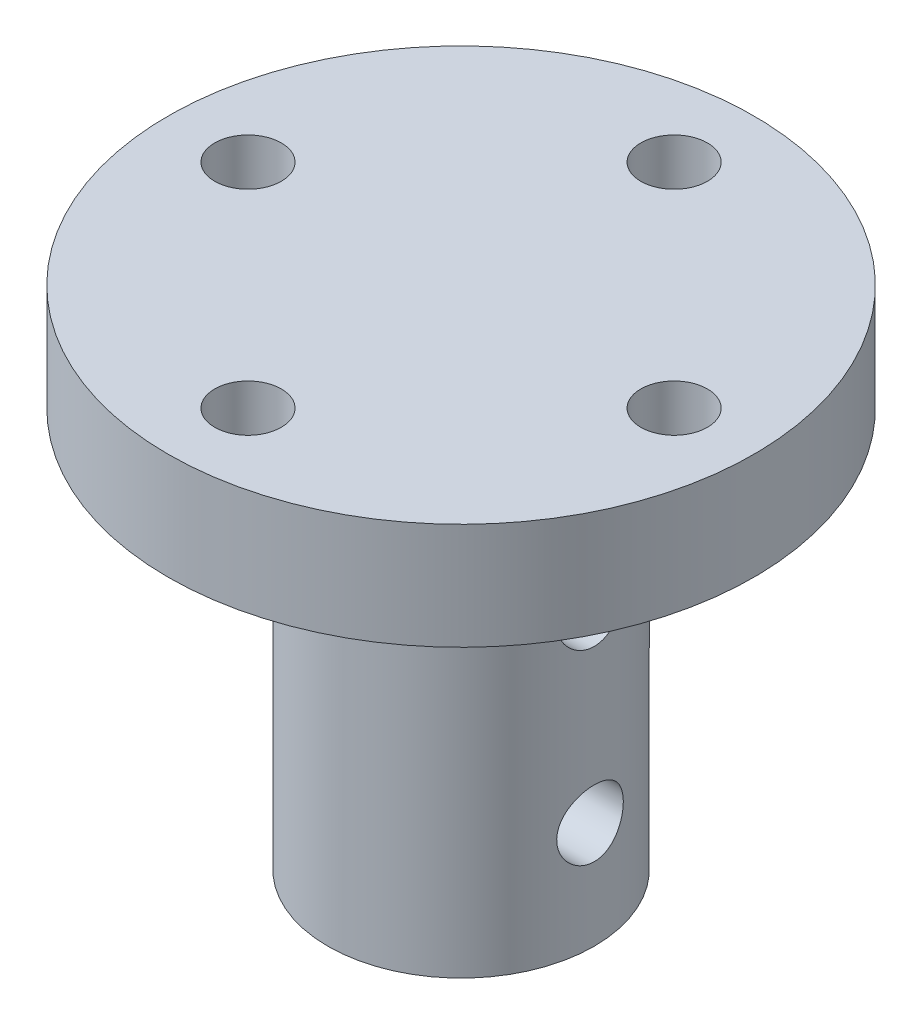
ISO-10303-21;
HEADER;
FILE_DESCRIPTION(('STEP AP214'),'2;1');
FILE_NAME('part.step','',(''),(''),'','','');
FILE_SCHEMA(('AUTOMOTIVE_DESIGN { 1 0 10303 214 1 1 1 1 }'));
ENDSEC;
DATA;
#1=APPLICATION_CONTEXT('core data for automotive mechanical design processes');
#2=APPLICATION_PROTOCOL_DEFINITION('international standard','automotive_design',2000,#1);
#3=PRODUCT_CONTEXT('',#1,'mechanical');
#4=PRODUCT('Part','Part','',(#3));
#5=PRODUCT_RELATED_PRODUCT_CATEGORY('part','',(#4));
#6=PRODUCT_DEFINITION_FORMATION('','',#4);
#7=PRODUCT_DEFINITION_CONTEXT('part definition',#1,'design');
#8=PRODUCT_DEFINITION('design','',#6,#7);
#9=PRODUCT_DEFINITION_SHAPE('','',#8);
#10=(LENGTH_UNIT() NAMED_UNIT(*) SI_UNIT(.MILLI.,.METRE.));
#11=(NAMED_UNIT(*) PLANE_ANGLE_UNIT() SI_UNIT($,.RADIAN.));
#12=(NAMED_UNIT(*) SI_UNIT($,.STERADIAN.) SOLID_ANGLE_UNIT());
#13=UNCERTAINTY_MEASURE_WITH_UNIT(LENGTH_MEASURE(1.E-05),#10,'distance_accuracy_value','');
#14=(GEOMETRIC_REPRESENTATION_CONTEXT(3) GLOBAL_UNCERTAINTY_ASSIGNED_CONTEXT((#13)) GLOBAL_UNIT_ASSIGNED_CONTEXT((#10,
#11,#12)) REPRESENTATION_CONTEXT('',''));
#15=CARTESIAN_POINT('',(0.,0.,0.));
#16=DIRECTION('',(0.,0.,1.));
#17=DIRECTION('',(1.,0.,0.));
#18=AXIS2_PLACEMENT_3D('',#15,#16,#17);
#19=CARTESIAN_POINT('',(0.,4.,0.));
#20=DIRECTION('',(0.,-1.,0.));
#21=DIRECTION('',(0.,0.,-1.));
#22=AXIS2_PLACEMENT_3D('',#19,#20,#21);
#23=CYLINDRICAL_SURFACE('',#22,11.);
#24=CARTESIAN_POINT('',(0.,4.,0.));
#25=DIRECTION('',(0.,1.,0.));
#26=DIRECTION('',(0.,0.,1.));
#27=AXIS2_PLACEMENT_3D('',#24,#25,#26);
#28=CIRCLE('',#27,11.);
#29=CARTESIAN_POINT('',(0.,4.,11.));
#30=VERTEX_POINT('',#29);
#31=EDGE_CURVE('E42',#30,#30,#28,.T.);
#32=ORIENTED_EDGE('',*,*,#31,.F.);
#33=EDGE_LOOP('',(#32));
#34=FACE_BOUND('',#33,.T.);
#35=CARTESIAN_POINT('',(0.,0.,0.));
#36=DIRECTION('',(0.,1.,0.));
#37=DIRECTION('',(0.,0.,1.));
#38=AXIS2_PLACEMENT_3D('',#35,#36,#37);
#39=CIRCLE('',#38,11.);
#40=CARTESIAN_POINT('',(0.,0.,11.));
#41=VERTEX_POINT('',#40);
#42=EDGE_CURVE('E47',#41,#41,#39,.T.);
#43=ORIENTED_EDGE('',*,*,#42,.T.);
#44=EDGE_LOOP('',(#43));
#45=FACE_BOUND('',#44,.T.);
#46=ADVANCED_FACE('F31',(#34,#45),#23,.T.);
#47=CARTESIAN_POINT('',(0.,4.,0.));
#48=DIRECTION('',(0.,1.,0.));
#49=DIRECTION('',(0.,0.,1.));
#50=AXIS2_PLACEMENT_3D('',#47,#48,#49);
#51=PLANE('',#50);
#52=CARTESIAN_POINT('',(8.,4.,0.));
#53=DIRECTION('',(0.,1.,0.));
#54=DIRECTION('',(0.,0.,1.));
#55=AXIS2_PLACEMENT_3D('',#52,#53,#54);
#56=CIRCLE('',#55,1.25);
#57=CARTESIAN_POINT('',(8.,4.,1.25));
#58=VERTEX_POINT('',#57);
#59=EDGE_CURVE('E142',#58,#58,#56,.T.);
#60=ORIENTED_EDGE('',*,*,#59,.F.);
#61=EDGE_LOOP('',(#60));
#62=FACE_BOUND('',#61,.T.);
#63=CARTESIAN_POINT('',(0.,4.,8.));
#64=DIRECTION('',(0.,1.,0.));
#65=DIRECTION('',(0.,0.,1.));
#66=AXIS2_PLACEMENT_3D('',#63,#64,#65);
#67=CIRCLE('',#66,1.25);
#68=CARTESIAN_POINT('',(0.,4.,9.25));
#69=VERTEX_POINT('',#68);
#70=EDGE_CURVE('E137',#69,#69,#67,.T.);
#71=ORIENTED_EDGE('',*,*,#70,.F.);
#72=EDGE_LOOP('',(#71));
#73=FACE_BOUND('',#72,.T.);
#74=CARTESIAN_POINT('',(-8.,4.,0.));
#75=DIRECTION('',(0.,1.,0.));
#76=DIRECTION('',(0.,0.,1.));
#77=AXIS2_PLACEMENT_3D('',#74,#75,#76);
#78=CIRCLE('',#77,1.25);
#79=CARTESIAN_POINT('',(-8.,4.,1.25));
#80=VERTEX_POINT('',#79);
#81=EDGE_CURVE('E131',#80,#80,#78,.T.);
#82=ORIENTED_EDGE('',*,*,#81,.F.);
#83=EDGE_LOOP('',(#82));
#84=FACE_BOUND('',#83,.T.);
#85=CARTESIAN_POINT('',(0.,4.,-8.));
#86=DIRECTION('',(0.,1.,0.));
#87=DIRECTION('',(0.,0.,1.));
#88=AXIS2_PLACEMENT_3D('',#85,#86,#87);
#89=CIRCLE('',#88,1.25);
#90=CARTESIAN_POINT('',(0.,4.,-6.75));
#91=VERTEX_POINT('',#90);
#92=EDGE_CURVE('E124',#91,#91,#89,.T.);
#93=ORIENTED_EDGE('',*,*,#92,.F.);
#94=EDGE_LOOP('',(#93));
#95=FACE_BOUND('',#94,.T.);
#96=ORIENTED_EDGE('',*,*,#31,.T.);
#97=EDGE_LOOP('',(#96));
#98=FACE_BOUND('',#97,.T.);
#99=ADVANCED_FACE('F88',(#62,#73,#84,#95,#98),#51,.T.);
#100=CARTESIAN_POINT('',(0.,0.,0.));
#101=DIRECTION('',(0.,1.,0.));
#102=DIRECTION('',(0.,0.,1.));
#103=AXIS2_PLACEMENT_3D('',#100,#101,#102);
#104=PLANE('',#103);
#105=CARTESIAN_POINT('',(8.,0.,0.));
#106=DIRECTION('',(0.,-1.,0.));
#107=DIRECTION('',(0.,0.,-1.));
#108=AXIS2_PLACEMENT_3D('',#105,#106,#107);
#109=CIRCLE('',#108,1.25);
#110=CARTESIAN_POINT('',(8.,0.,-1.25));
#111=VERTEX_POINT('',#110);
#112=EDGE_CURVE('E78',#111,#111,#109,.T.);
#113=ORIENTED_EDGE('',*,*,#112,.F.);
#114=EDGE_LOOP('',(#113));
#115=FACE_BOUND('',#114,.T.);
#116=CARTESIAN_POINT('',(0.,0.,8.));
#117=DIRECTION('',(0.,-1.,0.));
#118=DIRECTION('',(0.,0.,-1.));
#119=AXIS2_PLACEMENT_3D('',#116,#117,#118);
#120=CIRCLE('',#119,1.25);
#121=CARTESIAN_POINT('',(0.,0.,6.75));
#122=VERTEX_POINT('',#121);
#123=EDGE_CURVE('E140',#122,#122,#120,.T.);
#124=ORIENTED_EDGE('',*,*,#123,.F.);
#125=EDGE_LOOP('',(#124));
#126=FACE_BOUND('',#125,.T.);
#127=CARTESIAN_POINT('',(-8.,0.,0.));
#128=DIRECTION('',(0.,-1.,0.));
#129=DIRECTION('',(0.,0.,-1.));
#130=AXIS2_PLACEMENT_3D('',#127,#128,#129);
#131=CIRCLE('',#130,1.25);
#132=CARTESIAN_POINT('',(-8.,0.,-1.25));
#133=VERTEX_POINT('',#132);
#134=EDGE_CURVE('E134',#133,#133,#131,.T.);
#135=ORIENTED_EDGE('',*,*,#134,.F.);
#136=EDGE_LOOP('',(#135));
#137=FACE_BOUND('',#136,.T.);
#138=CARTESIAN_POINT('',(0.,0.,-8.));
#139=DIRECTION('',(0.,-1.,0.));
#140=DIRECTION('',(0.,0.,-1.));
#141=AXIS2_PLACEMENT_3D('',#138,#139,#140);
#142=CIRCLE('',#141,1.25);
#143=CARTESIAN_POINT('',(0.,0.,-9.25));
#144=VERTEX_POINT('',#143);
#145=EDGE_CURVE('E128',#144,#144,#142,.T.);
#146=ORIENTED_EDGE('',*,*,#145,.F.);
#147=EDGE_LOOP('',(#146));
#148=FACE_BOUND('',#147,.T.);
#149=CARTESIAN_POINT('',(0.,0.,0.));
#150=DIRECTION('',(0.,1.,0.));
#151=DIRECTION('',(0.,0.,1.));
#152=AXIS2_PLACEMENT_3D('',#149,#150,#151);
#153=CIRCLE('',#152,5.);
#154=CARTESIAN_POINT('',(0.,0.,5.));
#155=VERTEX_POINT('',#154);
#156=EDGE_CURVE('E10',#155,#155,#153,.F.);
#157=ORIENTED_EDGE('',*,*,#156,.F.);
#158=EDGE_LOOP('',(#157));
#159=FACE_BOUND('',#158,.T.);
#160=ORIENTED_EDGE('',*,*,#42,.F.);
#161=EDGE_LOOP('',(#160));
#162=FACE_BOUND('',#161,.T.);
#163=ADVANCED_FACE('F91',(#115,#126,#137,#148,#159,#162),#104,.F.);
#164=CARTESIAN_POINT('',(0.,-15.,0.));
#165=DIRECTION('',(0.,-1.,0.));
#166=DIRECTION('',(0.,0.,-1.));
#167=AXIS2_PLACEMENT_3D('',#164,#165,#166);
#168=PLANE('',#167);
#169=CARTESIAN_POINT('',(0.,-15.,0.));
#170=DIRECTION('',(0.,-1.,0.));
#171=DIRECTION('',(0.,0.,-1.));
#172=AXIS2_PLACEMENT_3D('',#169,#170,#171);
#173=CIRCLE('',#172,5.);
#174=CARTESIAN_POINT('',(0.,-15.,-5.));
#175=VERTEX_POINT('',#174);
#176=EDGE_CURVE('E114',#175,#175,#173,.T.);
#177=ORIENTED_EDGE('',*,*,#176,.T.);
#178=EDGE_LOOP('',(#177));
#179=FACE_BOUND('',#178,.T.);
#180=CARTESIAN_POINT('',(0.,-15.,0.));
#181=DIRECTION('',(0.,-1.,0.));
#182=DIRECTION('',(0.,0.,-1.));
#183=AXIS2_PLACEMENT_3D('',#180,#181,#182);
#184=CIRCLE('',#183,2.);
#185=CARTESIAN_POINT('',(0.,-15.,-2.));
#186=VERTEX_POINT('',#185);
#187=EDGE_CURVE('E116',#186,#186,#184,.T.);
#188=ORIENTED_EDGE('',*,*,#187,.F.);
#189=EDGE_LOOP('',(#188));
#190=FACE_BOUND('',#189,.T.);
#191=ADVANCED_FACE('F86',(#179,#190),#168,.T.);
#192=CARTESIAN_POINT('',(0.,-15.,0.));
#193=DIRECTION('',(0.,1.,0.));
#194=DIRECTION('',(0.,0.,1.));
#195=AXIS2_PLACEMENT_3D('',#192,#193,#194);
#196=CYLINDRICAL_SURFACE('',#195,5.);
#197=CARTESIAN_POINT('',(4.84122918275927,-11.,-1.25));
#198=CARTESIAN_POINT('',(4.84123050042654,-11.0690253754623,-1.24999803929589));
#199=CARTESIAN_POINT('',(4.84272153006957,-11.138072449339,-1.24426312274865));
#200=CARTESIAN_POINT('',(4.84850930996624,-11.274183789087,-1.22151156273207));
#201=CARTESIAN_POINT('',(4.85280769310907,-11.3412468772342,-1.2044883533711));
#202=CARTESIAN_POINT('',(4.86369362297984,-11.4714017690935,-1.15974559981597));
#203=CARTESIAN_POINT('',(4.87027821345204,-11.5344985776928,-1.13203986392723));
#204=CARTESIAN_POINT('',(4.88499096014404,-11.65515542627,-1.06676057063071));
#205=CARTESIAN_POINT('',(4.89311918189251,-11.7127152310401,-1.02918659428035));
#206=CARTESIAN_POINT('',(4.91020358177806,-11.8219308226311,-0.944354213655938));
#207=CARTESIAN_POINT('',(4.91917298811515,-11.873446800175,-0.896918443852025));
#208=CARTESIAN_POINT('',(4.93681437757649,-11.9678806971802,-0.794091032050333));
#209=CARTESIAN_POINT('',(4.94548633283195,-12.0107978128109,-0.738698647090154));
#210=CARTESIAN_POINT('',(4.96170207760291,-12.0873877338156,-0.620572600539478));
#211=CARTESIAN_POINT('',(4.96922843700296,-12.1209231940807,-0.557747288097561));
#212=CARTESIAN_POINT('',(4.98215405962992,-12.1769048220765,-0.427131592146382));
#213=CARTESIAN_POINT('',(4.98755363667172,-12.1993526259578,-0.35934194289597));
#214=CARTESIAN_POINT('',(4.9955237942409,-12.2320739172893,-0.22217937937708));
#215=CARTESIAN_POINT('',(4.99814946922157,-12.2425848221633,-0.152866359774487));
#216=CARTESIAN_POINT('',(5.00046797053649,-12.2518791896378,-0.0134144096313845));
#217=CARTESIAN_POINT('',(5.00016123048352,-12.2506643861048,0.0567243972690343));
#218=CARTESIAN_POINT('',(4.99669047476767,-12.2367125748749,0.194190308965484));
#219=CARTESIAN_POINT('',(4.99359001170437,-12.2242318374731,0.261545269501334));
#220=CARTESIAN_POINT('',(4.98495418262427,-12.1885143649758,0.393172809267108));
#221=CARTESIAN_POINT('',(4.9794186869922,-12.1652770573113,0.457445224213047));
#222=CARTESIAN_POINT('',(4.96643754850448,-12.1084987146565,0.581758379377258));
#223=CARTESIAN_POINT('',(4.95897509847527,-12.0748664776691,0.64175563720813));
#224=CARTESIAN_POINT('',(4.94294951904824,-11.9983221604419,0.755344527925611));
#225=CARTESIAN_POINT('',(4.93438619826245,-11.9554084657197,0.808935043856882));
#226=CARTESIAN_POINT('',(4.9168185688476,-11.8601456290088,0.909717543856196));
#227=CARTESIAN_POINT('',(4.90780859762959,-11.8075725538261,0.956697098844));
#228=CARTESIAN_POINT('',(4.89057521758353,-11.6952000132299,1.04122046995377));
#229=CARTESIAN_POINT('',(4.88235184552985,-11.6354002102545,1.07876384505752));
#230=CARTESIAN_POINT('',(4.86760248415824,-11.5098549829255,1.14348516127825));
#231=CARTESIAN_POINT('',(4.8610849186286,-11.4440821348434,1.17061195871311));
#232=CARTESIAN_POINT('',(4.85059320069978,-11.3087072659618,1.21335702579543));
#233=CARTESIAN_POINT('',(4.84661850405109,-11.2391060680084,1.22897775819114));
#234=CARTESIAN_POINT('',(4.8417767801957,-11.1000202492384,1.24791481933259));
#235=CARTESIAN_POINT('',(4.84083044546824,-11.0305811033352,1.25154523695981));
#236=CARTESIAN_POINT('',(4.8419367174052,-10.8920890317109,1.24725849525777));
#237=CARTESIAN_POINT('',(4.84398904800633,-10.8230360710244,1.2393423989244));
#238=CARTESIAN_POINT('',(4.8507854097728,-10.6884428675226,1.21246273196883));
#239=CARTESIAN_POINT('',(4.85548485117188,-10.6228636367146,1.19368203414087));
#240=CARTESIAN_POINT('',(4.86700359135481,-10.4957842710742,1.14580904083531));
#241=CARTESIAN_POINT('',(4.87382314124307,-10.4342846204723,1.11671552385627));
#242=CARTESIAN_POINT('',(4.88898068546631,-10.3157793610663,1.04838533396828));
#243=CARTESIAN_POINT('',(4.89734584303321,-10.2588855799784,1.00896087691781));
#244=CARTESIAN_POINT('',(4.91458541535858,-10.1524058185993,0.92132536616807));
#245=CARTESIAN_POINT('',(4.92345991364235,-10.102821041675,0.8731128685068));
#246=CARTESIAN_POINT('',(4.94098701515803,-10.0110944787145,0.767828401230908));
#247=CARTESIAN_POINT('',(4.94962851030918,-9.96916996872559,0.710564940664492));
#248=CARTESIAN_POINT('',(4.96548608306867,-9.89553206652438,0.589628353368345));
#249=CARTESIAN_POINT('',(4.9727022350198,-9.8638181416959,0.525955561196989));
#250=CARTESIAN_POINT('',(4.98485057869157,-9.81177698273603,0.394447752163863));
#251=CARTESIAN_POINT('',(4.98979915011205,-9.79136785781047,0.326646726284853));
#252=CARTESIAN_POINT('',(4.99692646697894,-9.76226983269579,0.188437200398511));
#253=CARTESIAN_POINT('',(4.99910574696704,-9.75357867063047,0.118029206301555));
#254=CARTESIAN_POINT('',(5.00042711761014,-9.74829051303058,-0.0213544080541575));
#255=CARTESIAN_POINT('',(4.9996497360001,-9.75137286363076,-0.0903172837075409));
#256=CARTESIAN_POINT('',(4.99532370571779,-9.76880978411791,-0.226709370518424));
#257=CARTESIAN_POINT('',(4.99177513946369,-9.78316401876638,-0.294138627226108));
#258=CARTESIAN_POINT('',(4.98231791067453,-9.82256527471366,-0.42521379455602));
#259=CARTESIAN_POINT('',(4.97642205628333,-9.84755431664328,-0.488878118226273));
#260=CARTESIAN_POINT('',(4.9628911114173,-9.90746322377416,-0.611146316301835));
#261=CARTESIAN_POINT('',(4.9552558017217,-9.94238434083696,-0.669749551581313));
#262=CARTESIAN_POINT('',(4.93884062101666,-10.0221440424963,-0.781752410529874));
#263=CARTESIAN_POINT('',(4.93003771182014,-10.0672001786342,-0.83499373537573));
#264=CARTESIAN_POINT('',(4.91238311316553,-10.1655285649672,-0.933268775339069));
#265=CARTESIAN_POINT('',(4.90353141190695,-10.2188028951224,-0.978300406335237));
#266=CARTESIAN_POINT('',(4.88659344825685,-10.3332517677517,-1.05970253309904));
#267=CARTESIAN_POINT('',(4.87852454662356,-10.3945551542658,-1.09589577430819));
#268=CARTESIAN_POINT('',(4.8642994443827,-10.5225693624034,-1.15740862076958));
#269=CARTESIAN_POINT('',(4.85814185308378,-10.5892762076334,-1.18273613719965));
#270=CARTESIAN_POINT('',(4.84939885924729,-10.7132212647834,-1.2180281607068));
#271=CARTESIAN_POINT('',(4.84635828750683,-10.7698664554798,-1.22999146324422));
#272=CARTESIAN_POINT('',(4.84227298231965,-10.88433608625,-1.24597786571659));
#273=CARTESIAN_POINT('',(4.84122807862454,-10.9421604253063,-1.25000164296523));
#274=CARTESIAN_POINT('',(4.84122918275927,-11.,-1.25));
#275=B_SPLINE_CURVE_WITH_KNOTS('',3,(#197,#198,#199,#200,#201,#202,#203,#204,#205,#206,#207,
#208,#209,#210,#211,#212,#213,#214,#215,#216,#217,#218,#219,#220,#221,#222,#223,#224,#225,#226,
#227,#228,#229,#230,#231,#232,#233,#234,#235,#236,#237,#238,#239,#240,#241,#242,#243,#244,#245,
#246,#247,#248,#249,#250,#251,#252,#253,#254,#255,#256,#257,#258,#259,#260,#261,#262,#263,#264,
#265,#266,#267,#268,#269,#270,#271,#272,#273,#274),.UNSPECIFIED.,.T.,.F.,(4,2,2,2,2,2,2,2,2,2,2,
2,2,2,2,2,2,2,2,2,2,2,2,2,2,2,2,2,2,2,2,2,2,2,2,2,2,2,4),(0.,0.206863720868071,
0.413847870714333,0.620565363583007,0.827291633777391,1.03811977096488,1.24896760739933,
1.4627574819896,1.67651579923546,1.88594375497673,2.0953407433301,2.30009131344474,
2.50485278362393,2.71146437127222,2.91811192734457,3.13035233285956,3.34260265599901,
3.55588216004201,3.76911600064774,3.97671787380859,4.18430063591901,4.38848702504604,
4.59269760710709,4.80091422929579,5.00916509442522,5.22262665482659,5.43607707859776,
5.64796036403464,5.85980274454519,6.06591723063728,6.2720255868849,6.47702438279855,
6.68204902869036,6.89198548291035,7.10197515782754,7.31588238642338,7.5296336068331,
7.70298913588665,7.8763298754976),.UNSPECIFIED.);
#276=CARTESIAN_POINT('',(4.84122918275927,-11.,-1.25));
#277=VERTEX_POINT('',#276);
#278=EDGE_CURVE('E56',#277,#277,#275,.T.);
#279=ORIENTED_EDGE('',*,*,#278,.T.);
#280=EDGE_LOOP('',(#279));
#281=FACE_BOUND('',#280,.T.);
#282=CARTESIAN_POINT('',(4.84122918275927,-4.,-1.25));
#283=CARTESIAN_POINT('',(4.84123050042654,-4.0690253754623,-1.24999803929589));
#284=CARTESIAN_POINT('',(4.84272153006957,-4.138072449339,-1.24426312274865));
#285=CARTESIAN_POINT('',(4.84850930996624,-4.27418378908702,-1.22151156273207));
#286=CARTESIAN_POINT('',(4.85280769310907,-4.34124687723416,-1.2044883533711));
#287=CARTESIAN_POINT('',(4.86369362297984,-4.47140176909352,-1.15974559981597));
#288=CARTESIAN_POINT('',(4.87027821345204,-4.53449857769284,-1.13203986392723));
#289=CARTESIAN_POINT('',(4.88499096014404,-4.65515542626996,-1.0667605706307));
#290=CARTESIAN_POINT('',(4.89311918189251,-4.71271523104011,-1.02918659428035));
#291=CARTESIAN_POINT('',(4.91020358177806,-4.8219308226311,-0.944354213655937));
#292=CARTESIAN_POINT('',(4.91917298811515,-4.87344680017502,-0.896918443852024));
#293=CARTESIAN_POINT('',(4.93681437757649,-4.96788069718017,-0.794091032050332));
#294=CARTESIAN_POINT('',(4.94548633283195,-5.01079781281087,-0.738698647090153));
#295=CARTESIAN_POINT('',(4.96170207760291,-5.08738773381564,-0.620572600539477));
#296=CARTESIAN_POINT('',(4.96922843700296,-5.12092319408073,-0.55774728809756));
#297=CARTESIAN_POINT('',(4.98215405962992,-5.17690482207654,-0.427131592146382));
#298=CARTESIAN_POINT('',(4.98755363667172,-5.19935262595776,-0.359341942895971));
#299=CARTESIAN_POINT('',(4.9955237942409,-5.23207391728929,-0.222179379377081));
#300=CARTESIAN_POINT('',(4.99814946922157,-5.24258482216329,-0.152866359774488));
#301=CARTESIAN_POINT('',(5.00046797053649,-5.25187918963778,-0.0134144096313853));
#302=CARTESIAN_POINT('',(5.00016123048352,-5.2506643861048,0.0567243972690337));
#303=CARTESIAN_POINT('',(4.99669047476767,-5.23671257487493,0.194190308965484));
#304=CARTESIAN_POINT('',(4.99359001170437,-5.22423183747307,0.261545269501334));
#305=CARTESIAN_POINT('',(4.98495418262427,-5.18851436497575,0.393172809267108));
#306=CARTESIAN_POINT('',(4.9794186869922,-5.1652770573113,0.457445224213047));
#307=CARTESIAN_POINT('',(4.96643754850448,-5.10849871465647,0.581758379377258));
#308=CARTESIAN_POINT('',(4.95897509847527,-5.07486647766913,0.64175563720813));
#309=CARTESIAN_POINT('',(4.94294951904824,-4.99832216044187,0.755344527925611));
#310=CARTESIAN_POINT('',(4.93438619826245,-4.95540846571969,0.808935043856881));
#311=CARTESIAN_POINT('',(4.9168185688476,-4.86014562900881,0.909717543856195));
#312=CARTESIAN_POINT('',(4.90780859762959,-4.80757255382611,0.956697098843999));
#313=CARTESIAN_POINT('',(4.89057521758353,-4.69520001322987,1.04122046995377));
#314=CARTESIAN_POINT('',(4.88235184552985,-4.6354002102545,1.07876384505752));
#315=CARTESIAN_POINT('',(4.86760248415824,-4.50985498292552,1.14348516127825));
#316=CARTESIAN_POINT('',(4.8610849186286,-4.4440821348434,1.17061195871311));
#317=CARTESIAN_POINT('',(4.85059320069978,-4.30870726596177,1.21335702579543));
#318=CARTESIAN_POINT('',(4.84661850405109,-4.23910606800843,1.22897775819114));
#319=CARTESIAN_POINT('',(4.8417767801957,-4.10002024923844,1.24791481933259));
#320=CARTESIAN_POINT('',(4.84083044546824,-4.03058110333519,1.25154523695981));
#321=CARTESIAN_POINT('',(4.8419367174052,-3.89208903171092,1.24725849525777));
#322=CARTESIAN_POINT('',(4.84398904800633,-3.82303607102438,1.2393423989244));
#323=CARTESIAN_POINT('',(4.8507854097728,-3.68844286752265,1.21246273196883));
#324=CARTESIAN_POINT('',(4.85548485117188,-3.62286363671458,1.19368203414087));
#325=CARTESIAN_POINT('',(4.86700359135481,-3.49578427107416,1.14580904083531));
#326=CARTESIAN_POINT('',(4.87382314124307,-3.43428462047233,1.11671552385627));
#327=CARTESIAN_POINT('',(4.88898068546631,-3.31577936106633,1.04838533396828));
#328=CARTESIAN_POINT('',(4.89734584303321,-3.25888557997845,1.00896087691781));
#329=CARTESIAN_POINT('',(4.91458541535858,-3.15240581859932,0.92132536616807));
#330=CARTESIAN_POINT('',(4.92345991364235,-3.10282104167496,0.8731128685068));
#331=CARTESIAN_POINT('',(4.94098701515803,-3.01109447871452,0.767828401230908));
#332=CARTESIAN_POINT('',(4.94962851030918,-2.96916996872559,0.710564940664491));
#333=CARTESIAN_POINT('',(4.96548608306867,-2.89553206652438,0.589628353368345));
#334=CARTESIAN_POINT('',(4.9727022350198,-2.8638181416959,0.525955561196989));
#335=CARTESIAN_POINT('',(4.98485057869157,-2.81177698273603,0.394447752163863));
#336=CARTESIAN_POINT('',(4.98979915011205,-2.79136785781047,0.326646726284852));
#337=CARTESIAN_POINT('',(4.99692646697894,-2.76226983269579,0.18843720039851));
#338=CARTESIAN_POINT('',(4.99910574696704,-2.75357867063047,0.118029206301555));
#339=CARTESIAN_POINT('',(5.00042711761014,-2.74829051303058,-0.0213544080541574));
#340=CARTESIAN_POINT('',(4.9996497360001,-2.75137286363076,-0.090317283707541));
#341=CARTESIAN_POINT('',(4.99532370571779,-2.76880978411791,-0.226709370518424));
#342=CARTESIAN_POINT('',(4.99177513946369,-2.78316401876638,-0.294138627226108));
#343=CARTESIAN_POINT('',(4.98231791067453,-2.82256527471366,-0.425213794556019));
#344=CARTESIAN_POINT('',(4.97642205628333,-2.84755431664328,-0.488878118226273));
#345=CARTESIAN_POINT('',(4.9628911114173,-2.90746322377416,-0.611146316301835));
#346=CARTESIAN_POINT('',(4.9552558017217,-2.94238434083696,-0.669749551581314));
#347=CARTESIAN_POINT('',(4.93884062101666,-3.02214404249634,-0.781752410529874));
#348=CARTESIAN_POINT('',(4.93003771182014,-3.06720017863422,-0.83499373537573));
#349=CARTESIAN_POINT('',(4.91238311316553,-3.16552856496725,-0.933268775339068));
#350=CARTESIAN_POINT('',(4.90353141190695,-3.21880289512238,-0.978300406335236));
#351=CARTESIAN_POINT('',(4.88659344825685,-3.33325176775167,-1.05970253309904));
#352=CARTESIAN_POINT('',(4.87852454662356,-3.39455515426578,-1.09589577430819));
#353=CARTESIAN_POINT('',(4.8642994443827,-3.52256936240338,-1.15740862076958));
#354=CARTESIAN_POINT('',(4.85814185308378,-3.58927620763343,-1.18273613719965));
#355=CARTESIAN_POINT('',(4.84939885924729,-3.7132212647834,-1.2180281607068));
#356=CARTESIAN_POINT('',(4.84635828750683,-3.76986645547983,-1.22999146324422));
#357=CARTESIAN_POINT('',(4.84227298231965,-3.88433608624995,-1.24597786571659));
#358=CARTESIAN_POINT('',(4.84122807862454,-3.94216042530633,-1.25000164296523));
#359=CARTESIAN_POINT('',(4.84122918275927,-4.,-1.25));
#360=B_SPLINE_CURVE_WITH_KNOTS('',3,(#282,#283,#284,#285,#286,#287,#288,#289,#290,#291,#292,
#293,#294,#295,#296,#297,#298,#299,#300,#301,#302,#303,#304,#305,#306,#307,#308,#309,#310,#311,
#312,#313,#314,#315,#316,#317,#318,#319,#320,#321,#322,#323,#324,#325,#326,#327,#328,#329,#330,
#331,#332,#333,#334,#335,#336,#337,#338,#339,#340,#341,#342,#343,#344,#345,#346,#347,#348,#349,
#350,#351,#352,#353,#354,#355,#356,#357,#358,#359),.UNSPECIFIED.,.T.,.F.,(4,2,2,2,2,2,2,2,2,2,2,
2,2,2,2,2,2,2,2,2,2,2,2,2,2,2,2,2,2,2,2,2,2,2,2,2,2,2,4),(0.,0.206863720868068,
0.413847870714333,0.620565363583011,0.827291633777393,1.03811977096488,1.24896760739933,
1.4627574819896,1.67651579923546,1.88594375497673,2.0953407433301,2.30009131344474,
2.50485278362393,2.71146437127222,2.91811192734457,3.13035233285956,3.34260265599901,
3.55588216004201,3.76911600064774,3.97671787380859,4.18430063591901,4.38848702504604,
4.59269760710709,4.80091422929579,5.00916509442522,5.22262665482659,5.43607707859777,
5.64796036403465,5.85980274454519,6.06591723063728,6.27202558688491,6.47702438279856,
6.68204902869036,6.89198548291036,7.10197515782755,7.31588238642339,7.5296336068331,
7.70298913588665,7.8763298754976),.UNSPECIFIED.);
#361=CARTESIAN_POINT('',(4.84122918275927,-4.,-1.25));
#362=VERTEX_POINT('',#361);
#363=EDGE_CURVE('E55',#362,#362,#360,.T.);
#364=ORIENTED_EDGE('',*,*,#363,.T.);
#365=EDGE_LOOP('',(#364));
#366=FACE_BOUND('',#365,.T.);
#367=ORIENTED_EDGE('',*,*,#176,.F.);
#368=EDGE_LOOP('',(#367));
#369=FACE_BOUND('',#368,.T.);
#370=ORIENTED_EDGE('',*,*,#156,.T.);
#371=EDGE_LOOP('',(#370));
#372=FACE_BOUND('',#371,.T.);
#373=ADVANCED_FACE('F82',(#281,#366,#369,#372),#196,.T.);
#374=CARTESIAN_POINT('',(0.,-15.,0.));
#375=DIRECTION('',(0.,1.,0.));
#376=DIRECTION('',(0.,0.,1.));
#377=AXIS2_PLACEMENT_3D('',#374,#375,#376);
#378=CYLINDRICAL_SURFACE('',#377,2.);
#379=CARTESIAN_POINT('',(1.5612494995996,-11.,-1.25));
#380=CARTESIAN_POINT('',(1.56125800072558,-11.0621202818029,-1.24999462210485));
#381=CARTESIAN_POINT('',(1.56502642708837,-11.1243378353703,-1.24532693849666));
#382=CARTESIAN_POINT('',(1.57943717205478,-11.2466763200794,-1.22698950832934));
#383=CARTESIAN_POINT('',(1.59009816464115,-11.3067910863652,-1.21329530430551));
#384=CARTESIAN_POINT('',(1.61650085329041,-11.4227823226988,-1.17788073911871));
#385=CARTESIAN_POINT('',(1.63219837418033,-11.4786906086818,-1.15622993332784));
#386=CARTESIAN_POINT('',(1.66682950714432,-11.5860088616382,-1.10571945561924));
#387=CARTESIAN_POINT('',(1.68576320748676,-11.6374187058565,-1.07685958706091));
#388=CARTESIAN_POINT('',(1.72779611374711,-11.741865154477,-1.00823937928364));
#389=CARTESIAN_POINT('',(1.75111338227346,-11.7941947408326,-0.967536093692503));
#390=CARTESIAN_POINT('',(1.79752820854877,-11.891882699145,-0.87830866449688));
#391=CARTESIAN_POINT('',(1.82062555863329,-11.9372349972839,-0.829777781297413));
#392=CARTESIAN_POINT('',(1.86729453891009,-12.0251035851481,-0.719186665258491));
#393=CARTESIAN_POINT('',(1.8905872224145,-12.0666176681043,-0.656200568910556));
#394=CARTESIAN_POINT('',(1.9318323169914,-12.1381252047632,-0.522404070837315));
#395=CARTESIAN_POINT('',(1.94979001179838,-12.1681300657513,-0.451601506478241));
#396=CARTESIAN_POINT('',(1.97669841318201,-12.2124823106071,-0.311776878362019));
#397=CARTESIAN_POINT('',(1.98637922422038,-12.2281114163969,-0.243305636047241));
#398=CARTESIAN_POINT('',(1.99850544379202,-12.2476320696434,-0.104105100662264));
#399=CARTESIAN_POINT('',(2.00095845843657,-12.2515359561206,-0.0333782605640275));
#400=CARTESIAN_POINT('',(1.99852909107528,-12.2476443107224,0.0980658284213396));
#401=CARTESIAN_POINT('',(1.99458699811902,-12.2413486236991,0.158852523273785));
#402=CARTESIAN_POINT('',(1.98145272261225,-12.2201330156367,0.278306645903669));
#403=CARTESIAN_POINT('',(1.97226014325117,-12.2052124427625,0.336973913146973));
#404=CARTESIAN_POINT('',(1.94938133614675,-12.1673962249029,0.450889117077073));
#405=CARTESIAN_POINT('',(1.93568361673912,-12.1444801759514,0.506127875493233));
#406=CARTESIAN_POINT('',(1.90485632889331,-12.09153124474,0.612019220469382));
#407=CARTESIAN_POINT('',(1.88772597874226,-12.0614967411094,0.662670758560001));
#408=CARTESIAN_POINT('',(1.84893224750793,-11.9909718346706,0.764713515567042));
#409=CARTESIAN_POINT('',(1.82697004307144,-11.9496453732577,0.81541234491895));
#410=CARTESIAN_POINT('',(1.78195462752237,-11.8598676197766,0.909598595905499));
#411=CARTESIAN_POINT('',(1.75889986449171,-11.8114059735535,0.953075338789633));
#412=CARTESIAN_POINT('',(1.71071442112196,-11.7012943770939,1.03735445892932));
#413=CARTESIAN_POINT('',(1.68570581533195,-11.6387486191497,1.07706615479946));
#414=CARTESIAN_POINT('',(1.64014139095399,-11.5063538802266,1.14526153203309));
#415=CARTESIAN_POINT('',(1.6195774019168,-11.4365186560446,1.17376589603358));
#416=CARTESIAN_POINT('',(1.5909187656712,-11.3102305971121,1.21218566853166));
#417=CARTESIAN_POINT('',(1.58096704305272,-11.2550890373623,1.22501841721721));
#418=CARTESIAN_POINT('',(1.56679138875765,-11.1428848112511,1.24310168537523));
#419=CARTESIAN_POINT('',(1.56255963237428,-11.0858248789601,1.24836256353275));
#420=CARTESIAN_POINT('',(1.56046133530164,-10.9712713194597,1.25098535954508));
#421=CARTESIAN_POINT('',(1.56260938140435,-10.9137769986342,1.24832917576576));
#422=CARTESIAN_POINT('',(1.57296042862705,-10.8002194189684,1.23525733555987));
#423=CARTESIAN_POINT('',(1.58116844404657,-10.7441573850371,1.22483525320262));
#424=CARTESIAN_POINT('',(1.60230060601957,-10.6357816161342,1.1970493572483));
#425=CARTESIAN_POINT('',(1.61514477937171,-10.5834213266685,1.17980280626788));
#426=CARTESIAN_POINT('',(1.64415573440841,-10.482212665443,1.13902451938523));
#427=CARTESIAN_POINT('',(1.66032369489908,-10.4333655479755,1.11549055271421));
#428=CARTESIAN_POINT('',(1.69787203988937,-10.330693960823,1.05765376772319));
#429=CARTESIAN_POINT('',(1.7196587573829,-10.2776924587507,1.02215373814221));
#430=CARTESIAN_POINT('',(1.76393958000711,-10.1778149475609,0.943690263224862));
#431=CARTESIAN_POINT('',(1.78643439903354,-10.130945383022,0.900719074496601));
#432=CARTESIAN_POINT('',(1.83383164018972,-10.0370167537568,0.800380659499194));
#433=CARTESIAN_POINT('',(1.85854204787597,-9.99113144299232,0.741809949714163));
#434=CARTESIAN_POINT('',(1.90384248964999,-9.90993134812414,0.616299987869577));
#435=CARTESIAN_POINT('',(1.92443445329133,-9.87461161002636,0.549364678748662));
#436=CARTESIAN_POINT('',(1.95809255957561,-9.81800500879736,0.412925900636599));
#437=CARTESIAN_POINT('',(1.9715348458918,-9.79600579352923,0.343814822544518));
#438=CARTESIAN_POINT('',(1.9910701008804,-9.76427333131891,0.201860998884746));
#439=CARTESIAN_POINT('',(1.99717323933003,-9.75452311023889,0.129023563238366));
#440=CARTESIAN_POINT('',(2.00096685748559,-9.74845347996122,-0.00659907199681255));
#441=CARTESIAN_POINT('',(1.99976600623617,-9.75036422321301,-0.0692812975954743));
#442=CARTESIAN_POINT('',(1.99160739958772,-9.76346167497433,-0.193279811091726));
#443=CARTESIAN_POINT('',(1.98464990541518,-9.77464796257577,-0.254596160840744));
#444=CARTESIAN_POINT('',(1.9659610468898,-9.8051604748766,-0.372043294685527));
#445=CARTESIAN_POINT('',(1.95440367471701,-9.8241908398732,-0.428280180678309));
#446=CARTESIAN_POINT('',(1.92744968677265,-9.86955992816407,-0.536714369111315));
#447=CARTESIAN_POINT('',(1.91205242331406,-9.89589988447559,-0.58891098811824));
#448=CARTESIAN_POINT('',(1.87675342239825,-9.9581605789912,-0.693656737470667));
#449=CARTESIAN_POINT('',(1.85655002466956,-9.99479198131898,-0.745680127162212));
#450=CARTESIAN_POINT('',(1.81433640456238,-10.0750766303327,-0.843216608355415));
#451=CARTESIAN_POINT('',(1.7923241573062,-10.1187378002459,-0.888722243055231));
#452=CARTESIAN_POINT('',(1.74500415099525,-10.2191162623033,-0.978723601300805));
#453=CARTESIAN_POINT('',(1.71967871446314,-10.2768083451769,-1.02212829873816));
#454=CARTESIAN_POINT('',(1.67174821497037,-10.3996446660101,-1.09877325005744));
#455=CARTESIAN_POINT('',(1.64914165167051,-10.4647847549076,-1.132019125571));
#456=CARTESIAN_POINT('',(1.61429776080214,-10.5864027679297,-1.18099110923231));
#457=CARTESIAN_POINT('',(1.60087340349652,-10.6416356808794,-1.19896216276381));
#458=CARTESIAN_POINT('',(1.57939158437939,-10.7549692779572,-1.22712822180408));
#459=CARTESIAN_POINT('',(1.57131714400176,-10.8130602550241,-1.23734784245405));
#460=CARTESIAN_POINT('',(1.56476456389394,-10.8930305238629,-1.24559906183097));
#461=CARTESIAN_POINT('',(1.56345069546827,-10.914364145517,-1.24724671259581));
#462=CARTESIAN_POINT('',(1.56169158695047,-10.9571279665215,-1.24944824734288));
#463=CARTESIAN_POINT('',(1.56124656529967,-10.9785581888017,-1.25000185626673));
#464=CARTESIAN_POINT('',(1.5612494995996,-11.,-1.25));
#465=B_SPLINE_CURVE_WITH_KNOTS('',3,(#379,#380,#381,#382,#383,#384,#385,#386,#387,#388,#389,
#390,#391,#392,#393,#394,#395,#396,#397,#398,#399,#400,#401,#402,#403,#404,#405,#406,#407,#408,
#409,#410,#411,#412,#413,#414,#415,#416,#417,#418,#419,#420,#421,#422,#423,#424,#425,#426,#427,
#428,#429,#430,#431,#432,#433,#434,#435,#436,#437,#438,#439,#440,#441,#442,#443,#444,#445,#446,
#447,#448,#449,#450,#451,#452,#453,#454,#455,#456,#457,#458,#459,#460,#461,#462,#463,#464),
.UNSPECIFIED.,.T.,.F.,(4,2,2,2,2,2,2,2,2,2,2,2,2,2,2,2,2,2,2,2,2,2,2,2,2,2,2,2,2,2,2,2,2,2,2,2,
2,2,2,2,2,2,4),(0.,0.186262444012015,0.373031654397095,0.558205556130398,0.743384509377749,
0.953406207440072,1.16360970997911,1.39917236034456,1.6345009273926,1.84590412815398,
2.05708478092387,2.23992319583511,2.42277543076414,2.60609774825956,2.78946186128171,
2.99564504832107,3.20213044016185,3.43558067920821,3.66859805095277,3.84032775480268,
4.01182230007289,4.18370925240739,4.35573859160081,4.52493212343598,4.69418576487135,
4.89566333610128,5.09735098485254,5.33136598660889,5.56527109061626,5.78520080494549,
6.00482541258961,6.19203601525124,6.37923812308583,6.55994569114424,6.74068376037881,
6.94018144108745,7.13990556958868,7.36841817421249,7.59680409585386,7.77496902270412,
7.95256577963385,8.01684109069498,8.08113255947022),.UNSPECIFIED.);
#466=CARTESIAN_POINT('',(1.5612494995996,-11.,-1.25));
#467=VERTEX_POINT('',#466);
#468=EDGE_CURVE('E34',#467,#467,#465,.T.);
#469=ORIENTED_EDGE('',*,*,#468,.F.);
#470=EDGE_LOOP('',(#469));
#471=FACE_BOUND('',#470,.T.);
#472=CARTESIAN_POINT('',(1.5612494995996,-4.,-1.25));
#473=CARTESIAN_POINT('',(1.56125800072558,-4.06212028180293,-1.24999462210485));
#474=CARTESIAN_POINT('',(1.56502642708837,-4.12433783537026,-1.24532693849666));
#475=CARTESIAN_POINT('',(1.57943717205478,-4.24667632007938,-1.22698950832934));
#476=CARTESIAN_POINT('',(1.59009816464115,-4.30679108636524,-1.21329530430551));
#477=CARTESIAN_POINT('',(1.61650085329041,-4.42278232269884,-1.17788073911871));
#478=CARTESIAN_POINT('',(1.63219837418033,-4.47869060868181,-1.15622993332784));
#479=CARTESIAN_POINT('',(1.66682950714432,-4.58600886163815,-1.10571945561924));
#480=CARTESIAN_POINT('',(1.68576320748676,-4.6374187058565,-1.07685958706091));
#481=CARTESIAN_POINT('',(1.72779611374711,-4.74186515447698,-1.00823937928364));
#482=CARTESIAN_POINT('',(1.75111338227346,-4.79419474083259,-0.967536093692503));
#483=CARTESIAN_POINT('',(1.79752820854877,-4.89188269914497,-0.87830866449688));
#484=CARTESIAN_POINT('',(1.82062555863329,-4.93723499728392,-0.829777781297414));
#485=CARTESIAN_POINT('',(1.86729453891009,-5.02510358514812,-0.719186665258492));
#486=CARTESIAN_POINT('',(1.8905872224145,-5.0666176681043,-0.656200568910557));
#487=CARTESIAN_POINT('',(1.9318323169914,-5.13812520476316,-0.522404070837316));
#488=CARTESIAN_POINT('',(1.94979001179838,-5.16813006575125,-0.451601506478242));
#489=CARTESIAN_POINT('',(1.97669841318201,-5.21248231060706,-0.311776878362019));
#490=CARTESIAN_POINT('',(1.98637922422038,-5.22811141639694,-0.243305636047242));
#491=CARTESIAN_POINT('',(1.99850544379202,-5.2476320696434,-0.104105100662264));
#492=CARTESIAN_POINT('',(2.00095845843657,-5.25153595612055,-0.0333782605640277));
#493=CARTESIAN_POINT('',(1.99852909107528,-5.24764431072239,0.0980658284213395));
#494=CARTESIAN_POINT('',(1.99458699811902,-5.2413486236991,0.158852523273785));
#495=CARTESIAN_POINT('',(1.98145272261225,-5.22013301563668,0.278306645903669));
#496=CARTESIAN_POINT('',(1.97226014325117,-5.20521244276248,0.336973913146973));
#497=CARTESIAN_POINT('',(1.94938133614675,-5.16739622490288,0.450889117077072));
#498=CARTESIAN_POINT('',(1.93568361673912,-5.14448017595141,0.506127875493233));
#499=CARTESIAN_POINT('',(1.90485632889331,-5.09153124474001,0.612019220469382));
#500=CARTESIAN_POINT('',(1.88772597874226,-5.0614967411094,0.662670758560001));
#501=CARTESIAN_POINT('',(1.84893224750793,-4.99097183467063,0.764713515567041));
#502=CARTESIAN_POINT('',(1.82697004307144,-4.94964537325767,0.815412344918949));
#503=CARTESIAN_POINT('',(1.78195462752237,-4.85986761977663,0.909598595905498));
#504=CARTESIAN_POINT('',(1.75889986449171,-4.81140597355345,0.953075338789632));
#505=CARTESIAN_POINT('',(1.71071442112196,-4.7012943770939,1.03735445892931));
#506=CARTESIAN_POINT('',(1.68570581533195,-4.6387486191497,1.07706615479946));
#507=CARTESIAN_POINT('',(1.640141390954,-4.50635388022658,1.14526153203309));
#508=CARTESIAN_POINT('',(1.6195774019168,-4.43651865604459,1.17376589603358));
#509=CARTESIAN_POINT('',(1.5909187656712,-4.31023059711213,1.21218566853166));
#510=CARTESIAN_POINT('',(1.58096704305272,-4.25508903736233,1.22501841721721));
#511=CARTESIAN_POINT('',(1.56679138875765,-4.14288481125107,1.24310168537523));
#512=CARTESIAN_POINT('',(1.56255963237428,-4.08582487896011,1.24836256353275));
#513=CARTESIAN_POINT('',(1.56046133530164,-3.97127131945973,1.25098535954508));
#514=CARTESIAN_POINT('',(1.56260938140435,-3.91377699863418,1.24832917576576));
#515=CARTESIAN_POINT('',(1.57296042862705,-3.8002194189684,1.23525733555987));
#516=CARTESIAN_POINT('',(1.58116844404656,-3.74415738503708,1.22483525320262));
#517=CARTESIAN_POINT('',(1.60230060601957,-3.6357816161342,1.1970493572483));
#518=CARTESIAN_POINT('',(1.61514477937171,-3.58342132666849,1.17980280626788));
#519=CARTESIAN_POINT('',(1.64415573440841,-3.48221266544302,1.13902451938523));
#520=CARTESIAN_POINT('',(1.66032369489908,-3.43336554797551,1.11549055271421));
#521=CARTESIAN_POINT('',(1.69787203988937,-3.33069396082297,1.0576537677232));
#522=CARTESIAN_POINT('',(1.71965875738289,-3.27769245875068,1.02215373814221));
#523=CARTESIAN_POINT('',(1.76393958000711,-3.17781494756085,0.943690263224865));
#524=CARTESIAN_POINT('',(1.78643439903354,-3.13094538302204,0.900719074496604));
#525=CARTESIAN_POINT('',(1.83383164018972,-3.03701675375685,0.800380659499197));
#526=CARTESIAN_POINT('',(1.85854204787597,-2.99113144299233,0.741809949714167));
#527=CARTESIAN_POINT('',(1.90384248964999,-2.90993134812415,0.616299987869581));
#528=CARTESIAN_POINT('',(1.92443445329132,-2.87461161002636,0.549364678748666));
#529=CARTESIAN_POINT('',(1.95809255957561,-2.81800500879736,0.412925900636603));
#530=CARTESIAN_POINT('',(1.9715348458918,-2.79600579352924,0.343814822544523));
#531=CARTESIAN_POINT('',(1.9910701008804,-2.76427333131891,0.20186099888475));
#532=CARTESIAN_POINT('',(1.99717323933003,-2.75452311023889,0.129023563238371));
#533=CARTESIAN_POINT('',(2.00096685748559,-2.74845347996122,-0.0065990719968082));
#534=CARTESIAN_POINT('',(1.99976600623617,-2.75036422321301,-0.06928129759547));
#535=CARTESIAN_POINT('',(1.99160739958772,-2.76346167497434,-0.193279811091722));
#536=CARTESIAN_POINT('',(1.98464990541518,-2.77464796257577,-0.25459616084074));
#537=CARTESIAN_POINT('',(1.9659610468898,-2.80516047487659,-0.372043294685523));
#538=CARTESIAN_POINT('',(1.95440367471701,-2.8241908398732,-0.428280180678306));
#539=CARTESIAN_POINT('',(1.92744968677265,-2.86955992816406,-0.536714369111312));
#540=CARTESIAN_POINT('',(1.91205242331406,-2.89589988447559,-0.588910988118237));
#541=CARTESIAN_POINT('',(1.87675342239825,-2.9581605789912,-0.693656737470664));
#542=CARTESIAN_POINT('',(1.85655002466956,-2.99479198131898,-0.745680127162209));
#543=CARTESIAN_POINT('',(1.81433640456238,-3.0750766303327,-0.843216608355411));
#544=CARTESIAN_POINT('',(1.79232415730621,-3.11873780024594,-0.888722243055227));
#545=CARTESIAN_POINT('',(1.74500415099525,-3.21911626230327,-0.978723601300803));
#546=CARTESIAN_POINT('',(1.71967871446314,-3.27680834517691,-1.02212829873816));
#547=CARTESIAN_POINT('',(1.67174821497037,-3.39964466601011,-1.09877325005744));
#548=CARTESIAN_POINT('',(1.64914165167052,-3.46478475490759,-1.132019125571));
#549=CARTESIAN_POINT('',(1.61429776080214,-3.58640276792966,-1.18099110923231));
#550=CARTESIAN_POINT('',(1.60087340349652,-3.64163568087936,-1.19896216276381));
#551=CARTESIAN_POINT('',(1.57939158437939,-3.75496927795719,-1.22712822180407));
#552=CARTESIAN_POINT('',(1.57131714400176,-3.81306025502414,-1.23734784245404));
#553=CARTESIAN_POINT('',(1.56476456389394,-3.89303052386285,-1.24559906183097));
#554=CARTESIAN_POINT('',(1.56345069546827,-3.91436414551698,-1.24724671259581));
#555=CARTESIAN_POINT('',(1.56169158695047,-3.95712796652148,-1.24944824734288));
#556=CARTESIAN_POINT('',(1.56124656529967,-3.97855818880168,-1.25000185626673));
#557=CARTESIAN_POINT('',(1.5612494995996,-4.,-1.25));
#558=B_SPLINE_CURVE_WITH_KNOTS('',3,(#472,#473,#474,#475,#476,#477,#478,#479,#480,#481,#482,
#483,#484,#485,#486,#487,#488,#489,#490,#491,#492,#493,#494,#495,#496,#497,#498,#499,#500,#501,
#502,#503,#504,#505,#506,#507,#508,#509,#510,#511,#512,#513,#514,#515,#516,#517,#518,#519,#520,
#521,#522,#523,#524,#525,#526,#527,#528,#529,#530,#531,#532,#533,#534,#535,#536,#537,#538,#539,
#540,#541,#542,#543,#544,#545,#546,#547,#548,#549,#550,#551,#552,#553,#554,#555,#556,#557),
.UNSPECIFIED.,.T.,.F.,(4,2,2,2,2,2,2,2,2,2,2,2,2,2,2,2,2,2,2,2,2,2,2,2,2,2,2,2,2,2,2,2,2,2,2,2,
2,2,2,2,2,2,4),(0.,0.186262444012014,0.373031654397095,0.558205556130401,0.743384509377749,
0.953406207440072,1.16360970997911,1.39917236034456,1.6345009273926,1.84590412815398,
2.05708478092387,2.23992319583511,2.42277543076414,2.60609774825956,2.78946186128171,
2.99564504832107,3.20213044016185,3.43558067920821,3.66859805095277,3.84032775480267,
4.01182230007289,4.18370925240739,4.35573859160081,4.52493212343598,4.69418576487135,
4.89566333610128,5.09735098485253,5.33136598660889,5.56527109061625,5.78520080494549,
6.00482541258961,6.19203601525123,6.37923812308582,6.55994569114423,6.7406837603788,
6.94018144108745,7.13990556958867,7.36841817421248,7.59680409585386,7.77496902270412,
7.95256577963385,8.01684109069497,8.08113255947022),.UNSPECIFIED.);
#559=CARTESIAN_POINT('',(1.5612494995996,-4.,-1.25));
#560=VERTEX_POINT('',#559);
#561=EDGE_CURVE('E50',#560,#560,#558,.T.);
#562=ORIENTED_EDGE('',*,*,#561,.F.);
#563=EDGE_LOOP('',(#562));
#564=FACE_BOUND('',#563,.T.);
#565=ORIENTED_EDGE('',*,*,#187,.T.);
#566=EDGE_LOOP('',(#565));
#567=FACE_BOUND('',#566,.T.);
#568=CARTESIAN_POINT('',(0.,0.,0.));
#569=DIRECTION('',(0.,-1.,0.));
#570=DIRECTION('',(0.,0.,-1.));
#571=AXIS2_PLACEMENT_3D('',#568,#569,#570);
#572=CIRCLE('',#571,2.);
#573=CARTESIAN_POINT('',(0.,0.,-2.));
#574=VERTEX_POINT('',#573);
#575=EDGE_CURVE('E120',#574,#574,#572,.T.);
#576=ORIENTED_EDGE('',*,*,#575,.F.);
#577=EDGE_LOOP('',(#576));
#578=FACE_BOUND('',#577,.T.);
#579=ADVANCED_FACE('F57',(#471,#564,#567,#578),#378,.F.);
#580=ORIENTED_EDGE('',*,*,#575,.T.);
#581=EDGE_LOOP('',(#580));
#582=FACE_BOUND('',#581,.T.);
#583=ADVANCED_FACE('F95',(#582),#104,.F.);
#584=CARTESIAN_POINT('',(0.,10.,-8.));
#585=DIRECTION('',(0.,-1.,0.));
#586=DIRECTION('',(0.,0.,-1.));
#587=AXIS2_PLACEMENT_3D('',#584,#585,#586);
#588=CYLINDRICAL_SURFACE('',#587,1.25);
#589=ORIENTED_EDGE('',*,*,#92,.T.);
#590=EDGE_LOOP('',(#589));
#591=FACE_BOUND('',#590,.T.);
#592=ORIENTED_EDGE('',*,*,#145,.T.);
#593=EDGE_LOOP('',(#592));
#594=FACE_BOUND('',#593,.T.);
#595=ADVANCED_FACE('F103',(#591,#594),#588,.F.);
#596=CARTESIAN_POINT('',(-8.,10.,0.));
#597=DIRECTION('',(0.,-1.,0.));
#598=DIRECTION('',(0.,0.,-1.));
#599=AXIS2_PLACEMENT_3D('',#596,#597,#598);
#600=CYLINDRICAL_SURFACE('',#599,1.25);
#601=ORIENTED_EDGE('',*,*,#81,.T.);
#602=EDGE_LOOP('',(#601));
#603=FACE_BOUND('',#602,.T.);
#604=ORIENTED_EDGE('',*,*,#134,.T.);
#605=EDGE_LOOP('',(#604));
#606=FACE_BOUND('',#605,.T.);
#607=ADVANCED_FACE('F153',(#603,#606),#600,.F.);
#608=CARTESIAN_POINT('',(0.,10.,8.));
#609=DIRECTION('',(0.,-1.,0.));
#610=DIRECTION('',(0.,0.,-1.));
#611=AXIS2_PLACEMENT_3D('',#608,#609,#610);
#612=CYLINDRICAL_SURFACE('',#611,1.25);
#613=ORIENTED_EDGE('',*,*,#70,.T.);
#614=EDGE_LOOP('',(#613));
#615=FACE_BOUND('',#614,.T.);
#616=ORIENTED_EDGE('',*,*,#123,.T.);
#617=EDGE_LOOP('',(#616));
#618=FACE_BOUND('',#617,.T.);
#619=ADVANCED_FACE('F149',(#615,#618),#612,.F.);
#620=CARTESIAN_POINT('',(8.,10.,0.));
#621=DIRECTION('',(0.,-1.,0.));
#622=DIRECTION('',(0.,0.,-1.));
#623=AXIS2_PLACEMENT_3D('',#620,#621,#622);
#624=CYLINDRICAL_SURFACE('',#623,1.25);
#625=ORIENTED_EDGE('',*,*,#59,.T.);
#626=EDGE_LOOP('',(#625));
#627=FACE_BOUND('',#626,.T.);
#628=ORIENTED_EDGE('',*,*,#112,.T.);
#629=EDGE_LOOP('',(#628));
#630=FACE_BOUND('',#629,.T.);
#631=ADVANCED_FACE('F66',(#627,#630),#624,.F.);
#632=CARTESIAN_POINT('',(1.,-4.,0.));
#633=DIRECTION('',(1.,0.,0.));
#634=DIRECTION('',(0.,0.,-1.));
#635=AXIS2_PLACEMENT_3D('',#632,#633,#634);
#636=CYLINDRICAL_SURFACE('',#635,1.25);
#637=ORIENTED_EDGE('',*,*,#561,.T.);
#638=EDGE_LOOP('',(#637));
#639=FACE_BOUND('',#638,.T.);
#640=ORIENTED_EDGE('',*,*,#363,.F.);
#641=EDGE_LOOP('',(#640));
#642=FACE_BOUND('',#641,.T.);
#643=ADVANCED_FACE('F61',(#639,#642),#636,.F.);
#644=CARTESIAN_POINT('',(1.,-11.,0.));
#645=DIRECTION('',(1.,0.,0.));
#646=DIRECTION('',(0.,0.,-1.));
#647=AXIS2_PLACEMENT_3D('',#644,#645,#646);
#648=CYLINDRICAL_SURFACE('',#647,1.25);
#649=ORIENTED_EDGE('',*,*,#468,.T.);
#650=EDGE_LOOP('',(#649));
#651=FACE_BOUND('',#650,.T.);
#652=ORIENTED_EDGE('',*,*,#278,.F.);
#653=EDGE_LOOP('',(#652));
#654=FACE_BOUND('',#653,.T.);
#655=ADVANCED_FACE('F65',(#651,#654),#648,.F.);
#656=CLOSED_SHELL('',(#46,#99,#163,#191,#373,#579,#583,#595,#607,#619,#631,#643,#655));
#657=MANIFOLD_SOLID_BREP('B2',#656);
#658=ADVANCED_BREP_SHAPE_REPRESENTATION('',(#18,#657),#14);
#659=SHAPE_DEFINITION_REPRESENTATION(#9,#658);
ENDSEC;
END-ISO-10303-21;
